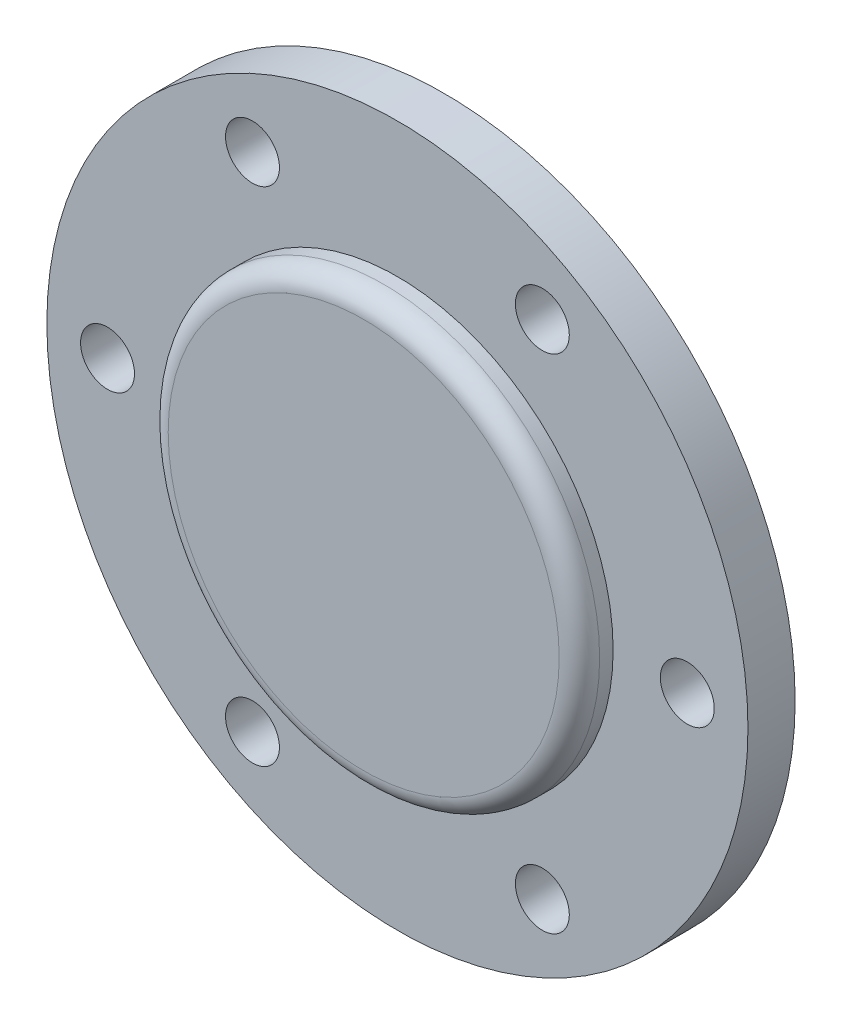
ISO-10303-21;
HEADER;
FILE_DESCRIPTION(('STEP AP214'),'2;1');
FILE_NAME('part.step','',(''),(''),'','','');
FILE_SCHEMA(('AUTOMOTIVE_DESIGN { 1 0 10303 214 1 1 1 1 }'));
ENDSEC;
DATA;
#1=APPLICATION_CONTEXT('core data for automotive mechanical design processes');
#2=APPLICATION_PROTOCOL_DEFINITION('international standard','automotive_design',2000,#1);
#3=PRODUCT_CONTEXT('',#1,'mechanical');
#4=PRODUCT('Part','Part','',(#3));
#5=PRODUCT_RELATED_PRODUCT_CATEGORY('part','',(#4));
#6=PRODUCT_DEFINITION_FORMATION('','',#4);
#7=PRODUCT_DEFINITION_CONTEXT('part definition',#1,'design');
#8=PRODUCT_DEFINITION('design','',#6,#7);
#9=PRODUCT_DEFINITION_SHAPE('','',#8);
#10=(LENGTH_UNIT() NAMED_UNIT(*) SI_UNIT(.MILLI.,.METRE.));
#11=(NAMED_UNIT(*) PLANE_ANGLE_UNIT() SI_UNIT($,.RADIAN.));
#12=(NAMED_UNIT(*) SI_UNIT($,.STERADIAN.) SOLID_ANGLE_UNIT());
#13=UNCERTAINTY_MEASURE_WITH_UNIT(LENGTH_MEASURE(1.E-05),#10,'distance_accuracy_value','');
#14=(GEOMETRIC_REPRESENTATION_CONTEXT(3) GLOBAL_UNCERTAINTY_ASSIGNED_CONTEXT((#13)) GLOBAL_UNIT_ASSIGNED_CONTEXT((#10,
#11,#12)) REPRESENTATION_CONTEXT('',''));
#15=CARTESIAN_POINT('',(0.,0.,0.));
#16=DIRECTION('',(0.,0.,1.));
#17=DIRECTION('',(1.,0.,0.));
#18=AXIS2_PLACEMENT_3D('',#15,#16,#17);
#19=CARTESIAN_POINT('',(0.,0.,3.5));
#20=DIRECTION('',(0.,0.,1.));
#21=DIRECTION('',(1.,0.,0.));
#22=AXIS2_PLACEMENT_3D('',#19,#20,#21);
#23=PLANE('',#22);
#24=CARTESIAN_POINT('',(0.,0.,3.5));
#25=DIRECTION('',(0.,0.,1.));
#26=DIRECTION('',(1.,0.,0.));
#27=AXIS2_PLACEMENT_3D('',#24,#25,#26);
#28=CIRCLE('',#27,16.);
#29=CARTESIAN_POINT('',(16.,0.,3.5));
#30=VERTEX_POINT('',#29);
#31=EDGE_CURVE('E55',#30,#30,#28,.T.);
#32=ORIENTED_EDGE('',*,*,#31,.F.);
#33=EDGE_LOOP('',(#32));
#34=FACE_BOUND('',#33,.T.);
#35=CARTESIAN_POINT('',(10.7499999999998,-18.6195461813655,3.5));
#36=DIRECTION('',(0.,0.,1.));
#37=DIRECTION('',(1.,0.,0.));
#38=AXIS2_PLACEMENT_3D('',#35,#36,#37);
#39=CIRCLE('',#38,2.);
#40=CARTESIAN_POINT('',(12.7499999999998,-18.6195461813655,3.5));
#41=VERTEX_POINT('',#40);
#42=EDGE_CURVE('E68',#41,#41,#39,.T.);
#43=ORIENTED_EDGE('',*,*,#42,.F.);
#44=EDGE_LOOP('',(#43));
#45=FACE_BOUND('',#44,.T.);
#46=CARTESIAN_POINT('',(10.7500000000001,18.6195461813654,3.5));
#47=DIRECTION('',(0.,0.,1.));
#48=DIRECTION('',(1.,0.,0.));
#49=AXIS2_PLACEMENT_3D('',#46,#47,#48);
#50=CIRCLE('',#49,2.00000000000001);
#51=CARTESIAN_POINT('',(12.7500000000001,18.6195461813654,3.5));
#52=VERTEX_POINT('',#51);
#53=EDGE_CURVE('E84',#52,#52,#50,.T.);
#54=ORIENTED_EDGE('',*,*,#53,.F.);
#55=EDGE_LOOP('',(#54));
#56=FACE_BOUND('',#55,.T.);
#57=CARTESIAN_POINT('',(-21.5,0.,3.5));
#58=DIRECTION('',(0.,0.,1.));
#59=DIRECTION('',(1.,0.,0.));
#60=AXIS2_PLACEMENT_3D('',#57,#58,#59);
#61=CIRCLE('',#60,2.);
#62=CARTESIAN_POINT('',(-19.5,0.,3.5));
#63=VERTEX_POINT('',#62);
#64=EDGE_CURVE('E100',#63,#63,#61,.T.);
#65=ORIENTED_EDGE('',*,*,#64,.F.);
#66=EDGE_LOOP('',(#65));
#67=FACE_BOUND('',#66,.T.);
#68=CARTESIAN_POINT('',(0.,0.,3.5));
#69=DIRECTION('',(0.,0.,1.));
#70=DIRECTION('',(1.,0.,0.));
#71=AXIS2_PLACEMENT_3D('',#68,#69,#70);
#72=CIRCLE('',#71,26.);
#73=CARTESIAN_POINT('',(26.,0.,3.5));
#74=VERTEX_POINT('',#73);
#75=EDGE_CURVE('E108',#74,#74,#72,.T.);
#76=ORIENTED_EDGE('',*,*,#75,.T.);
#77=EDGE_LOOP('',(#76));
#78=FACE_BOUND('',#77,.T.);
#79=CARTESIAN_POINT('',(-10.75,18.6195461813655,3.5));
#80=DIRECTION('',(0.,0.,1.));
#81=DIRECTION('',(1.,0.,0.));
#82=AXIS2_PLACEMENT_3D('',#79,#80,#81);
#83=CIRCLE('',#82,2.);
#84=CARTESIAN_POINT('',(-8.74999999999995,18.6195461813655,3.5));
#85=VERTEX_POINT('',#84);
#86=EDGE_CURVE('E92',#85,#85,#83,.T.);
#87=ORIENTED_EDGE('',*,*,#86,.F.);
#88=EDGE_LOOP('',(#87));
#89=FACE_BOUND('',#88,.T.);
#90=CARTESIAN_POINT('',(21.5,-1.50133697570255E-13,3.5));
#91=DIRECTION('',(0.,0.,1.));
#92=DIRECTION('',(1.,0.,0.));
#93=AXIS2_PLACEMENT_3D('',#90,#91,#92);
#94=CIRCLE('',#93,2.);
#95=CARTESIAN_POINT('',(23.5,-1.50133697570255E-13,3.5));
#96=VERTEX_POINT('',#95);
#97=EDGE_CURVE('E76',#96,#96,#94,.T.);
#98=ORIENTED_EDGE('',*,*,#97,.F.);
#99=EDGE_LOOP('',(#98));
#100=FACE_BOUND('',#99,.T.);
#101=CARTESIAN_POINT('',(-10.7500000000002,-18.6195461813653,3.5));
#102=DIRECTION('',(0.,0.,1.));
#103=DIRECTION('',(1.,0.,0.));
#104=AXIS2_PLACEMENT_3D('',#101,#102,#103);
#105=CIRCLE('',#104,2.);
#106=CARTESIAN_POINT('',(-8.75000000000021,-18.6195461813653,3.5));
#107=VERTEX_POINT('',#106);
#108=EDGE_CURVE('E60',#107,#107,#105,.T.);
#109=ORIENTED_EDGE('',*,*,#108,.F.);
#110=EDGE_LOOP('',(#109));
#111=FACE_BOUND('',#110,.T.);
#112=ADVANCED_FACE('F37',(#34,#45,#56,#67,#78,#89,#100,#111),#23,.T.);
#113=CARTESIAN_POINT('',(0.,0.,0.));
#114=DIRECTION('',(0.,0.,1.));
#115=DIRECTION('',(1.,0.,0.));
#116=AXIS2_PLACEMENT_3D('',#113,#114,#115);
#117=PLANE('',#116);
#118=CARTESIAN_POINT('',(0.,0.,0.));
#119=DIRECTION('',(0.,0.,-1.));
#120=DIRECTION('',(-1.,0.,0.));
#121=AXIS2_PLACEMENT_3D('',#118,#119,#120);
#122=CIRCLE('',#121,15.);
#123=CARTESIAN_POINT('',(-15.,0.,0.));
#124=VERTEX_POINT('',#123);
#125=EDGE_CURVE('E10',#124,#124,#122,.T.);
#126=ORIENTED_EDGE('',*,*,#125,.F.);
#127=EDGE_LOOP('',(#126));
#128=FACE_BOUND('',#127,.T.);
#129=CARTESIAN_POINT('',(0.,0.,0.));
#130=DIRECTION('',(0.,0.,1.));
#131=DIRECTION('',(1.,0.,0.));
#132=AXIS2_PLACEMENT_3D('',#129,#130,#131);
#133=CIRCLE('',#132,26.);
#134=CARTESIAN_POINT('',(26.,0.,0.));
#135=VERTEX_POINT('',#134);
#136=EDGE_CURVE('E104',#135,#135,#133,.T.);
#137=ORIENTED_EDGE('',*,*,#136,.F.);
#138=EDGE_LOOP('',(#137));
#139=FACE_BOUND('',#138,.T.);
#140=CARTESIAN_POINT('',(-21.5,0.,0.));
#141=DIRECTION('',(0.,0.,1.));
#142=DIRECTION('',(1.,0.,0.));
#143=AXIS2_PLACEMENT_3D('',#140,#141,#142);
#144=CIRCLE('',#143,2.);
#145=CARTESIAN_POINT('',(-19.5,0.,0.));
#146=VERTEX_POINT('',#145);
#147=EDGE_CURVE('E96',#146,#146,#144,.T.);
#148=ORIENTED_EDGE('',*,*,#147,.T.);
#149=EDGE_LOOP('',(#148));
#150=FACE_BOUND('',#149,.T.);
#151=CARTESIAN_POINT('',(-10.75,18.6195461813655,0.));
#152=DIRECTION('',(0.,0.,1.));
#153=DIRECTION('',(1.,0.,0.));
#154=AXIS2_PLACEMENT_3D('',#151,#152,#153);
#155=CIRCLE('',#154,2.);
#156=CARTESIAN_POINT('',(-8.74999999999995,18.6195461813655,0.));
#157=VERTEX_POINT('',#156);
#158=EDGE_CURVE('E88',#157,#157,#155,.T.);
#159=ORIENTED_EDGE('',*,*,#158,.T.);
#160=EDGE_LOOP('',(#159));
#161=FACE_BOUND('',#160,.T.);
#162=CARTESIAN_POINT('',(10.7500000000001,18.6195461813654,0.));
#163=DIRECTION('',(0.,0.,1.));
#164=DIRECTION('',(1.,0.,0.));
#165=AXIS2_PLACEMENT_3D('',#162,#163,#164);
#166=CIRCLE('',#165,2.00000000000001);
#167=CARTESIAN_POINT('',(12.7500000000001,18.6195461813654,0.));
#168=VERTEX_POINT('',#167);
#169=EDGE_CURVE('E80',#168,#168,#166,.T.);
#170=ORIENTED_EDGE('',*,*,#169,.T.);
#171=EDGE_LOOP('',(#170));
#172=FACE_BOUND('',#171,.T.);
#173=CARTESIAN_POINT('',(21.5,-1.50133697570255E-13,0.));
#174=DIRECTION('',(0.,0.,1.));
#175=DIRECTION('',(1.,0.,0.));
#176=AXIS2_PLACEMENT_3D('',#173,#174,#175);
#177=CIRCLE('',#176,2.);
#178=CARTESIAN_POINT('',(23.5,-1.50133697570255E-13,0.));
#179=VERTEX_POINT('',#178);
#180=EDGE_CURVE('E72',#179,#179,#177,.T.);
#181=ORIENTED_EDGE('',*,*,#180,.T.);
#182=EDGE_LOOP('',(#181));
#183=FACE_BOUND('',#182,.T.);
#184=CARTESIAN_POINT('',(10.7499999999998,-18.6195461813655,0.));
#185=DIRECTION('',(0.,0.,1.));
#186=DIRECTION('',(1.,0.,0.));
#187=AXIS2_PLACEMENT_3D('',#184,#185,#186);
#188=CIRCLE('',#187,2.);
#189=CARTESIAN_POINT('',(12.7499999999998,-18.6195461813655,0.));
#190=VERTEX_POINT('',#189);
#191=EDGE_CURVE('E64',#190,#190,#188,.T.);
#192=ORIENTED_EDGE('',*,*,#191,.T.);
#193=EDGE_LOOP('',(#192));
#194=FACE_BOUND('',#193,.T.);
#195=CARTESIAN_POINT('',(-10.7500000000002,-18.6195461813653,0.));
#196=DIRECTION('',(0.,0.,1.));
#197=DIRECTION('',(1.,0.,0.));
#198=AXIS2_PLACEMENT_3D('',#195,#196,#197);
#199=CIRCLE('',#198,2.);
#200=CARTESIAN_POINT('',(-8.75000000000021,-18.6195461813653,0.));
#201=VERTEX_POINT('',#200);
#202=EDGE_CURVE('E59',#201,#201,#199,.T.);
#203=ORIENTED_EDGE('',*,*,#202,.T.);
#204=EDGE_LOOP('',(#203));
#205=FACE_BOUND('',#204,.T.);
#206=ADVANCED_FACE('F134',(#128,#139,#150,#161,#172,#183,#194,#205),#117,.F.);
#207=CARTESIAN_POINT('',(0.,0.,3.5));
#208=DIRECTION('',(0.,0.,-1.));
#209=DIRECTION('',(-1.,0.,0.));
#210=AXIS2_PLACEMENT_3D('',#207,#208,#209);
#211=CYLINDRICAL_SURFACE('',#210,26.);
#212=ORIENTED_EDGE('',*,*,#75,.F.);
#213=EDGE_LOOP('',(#212));
#214=FACE_BOUND('',#213,.T.);
#215=ORIENTED_EDGE('',*,*,#136,.T.);
#216=EDGE_LOOP('',(#215));
#217=FACE_BOUND('',#216,.T.);
#218=ADVANCED_FACE('F140',(#214,#217),#211,.T.);
#219=CARTESIAN_POINT('',(-21.5,0.,3.5));
#220=DIRECTION('',(0.,0.,-1.));
#221=DIRECTION('',(-1.,0.,0.));
#222=AXIS2_PLACEMENT_3D('',#219,#220,#221);
#223=CYLINDRICAL_SURFACE('',#222,2.);
#224=ORIENTED_EDGE('',*,*,#64,.T.);
#225=EDGE_LOOP('',(#224));
#226=FACE_BOUND('',#225,.T.);
#227=ORIENTED_EDGE('',*,*,#147,.F.);
#228=EDGE_LOOP('',(#227));
#229=FACE_BOUND('',#228,.T.);
#230=ADVANCED_FACE('F146',(#226,#229),#223,.F.);
#231=CARTESIAN_POINT('',(-10.75,18.6195461813655,3.5));
#232=DIRECTION('',(0.,0.,-1.));
#233=DIRECTION('',(-1.,0.,0.));
#234=AXIS2_PLACEMENT_3D('',#231,#232,#233);
#235=CYLINDRICAL_SURFACE('',#234,2.);
#236=ORIENTED_EDGE('',*,*,#86,.T.);
#237=EDGE_LOOP('',(#236));
#238=FACE_BOUND('',#237,.T.);
#239=ORIENTED_EDGE('',*,*,#158,.F.);
#240=EDGE_LOOP('',(#239));
#241=FACE_BOUND('',#240,.T.);
#242=ADVANCED_FACE('F153',(#238,#241),#235,.F.);
#243=CARTESIAN_POINT('',(10.7500000000001,18.6195461813654,3.5));
#244=DIRECTION('',(0.,0.,-1.));
#245=DIRECTION('',(-1.,0.,0.));
#246=AXIS2_PLACEMENT_3D('',#243,#244,#245);
#247=CYLINDRICAL_SURFACE('',#246,2.00000000000001);
#248=ORIENTED_EDGE('',*,*,#53,.T.);
#249=EDGE_LOOP('',(#248));
#250=FACE_BOUND('',#249,.T.);
#251=ORIENTED_EDGE('',*,*,#169,.F.);
#252=EDGE_LOOP('',(#251));
#253=FACE_BOUND('',#252,.T.);
#254=ADVANCED_FACE('F189',(#250,#253),#247,.F.);
#255=CARTESIAN_POINT('',(21.5,-1.50133697570255E-13,3.5));
#256=DIRECTION('',(0.,0.,-1.));
#257=DIRECTION('',(-1.,0.,0.));
#258=AXIS2_PLACEMENT_3D('',#255,#256,#257);
#259=CYLINDRICAL_SURFACE('',#258,2.);
#260=ORIENTED_EDGE('',*,*,#97,.T.);
#261=EDGE_LOOP('',(#260));
#262=FACE_BOUND('',#261,.T.);
#263=ORIENTED_EDGE('',*,*,#180,.F.);
#264=EDGE_LOOP('',(#263));
#265=FACE_BOUND('',#264,.T.);
#266=ADVANCED_FACE('F183',(#262,#265),#259,.F.);
#267=CARTESIAN_POINT('',(10.7499999999998,-18.6195461813655,3.5));
#268=DIRECTION('',(0.,0.,-1.));
#269=DIRECTION('',(-1.,0.,0.));
#270=AXIS2_PLACEMENT_3D('',#267,#268,#269);
#271=CYLINDRICAL_SURFACE('',#270,2.);
#272=ORIENTED_EDGE('',*,*,#42,.T.);
#273=EDGE_LOOP('',(#272));
#274=FACE_BOUND('',#273,.T.);
#275=ORIENTED_EDGE('',*,*,#191,.F.);
#276=EDGE_LOOP('',(#275));
#277=FACE_BOUND('',#276,.T.);
#278=ADVANCED_FACE('F174',(#274,#277),#271,.F.);
#279=CARTESIAN_POINT('',(-10.7500000000002,-18.6195461813653,3.5));
#280=DIRECTION('',(0.,0.,-1.));
#281=DIRECTION('',(-1.,0.,0.));
#282=AXIS2_PLACEMENT_3D('',#279,#280,#281);
#283=CYLINDRICAL_SURFACE('',#282,2.);
#284=ORIENTED_EDGE('',*,*,#108,.T.);
#285=EDGE_LOOP('',(#284));
#286=FACE_BOUND('',#285,.T.);
#287=ORIENTED_EDGE('',*,*,#202,.F.);
#288=EDGE_LOOP('',(#287));
#289=FACE_BOUND('',#288,.T.);
#290=ADVANCED_FACE('F172',(#286,#289),#283,.F.);
#291=CARTESIAN_POINT('',(0.,0.,6.));
#292=DIRECTION('',(0.,0.,-1.));
#293=DIRECTION('',(-1.,0.,0.));
#294=AXIS2_PLACEMENT_3D('',#291,#292,#293);
#295=CYLINDRICAL_SURFACE('',#294,16.);
#296=CARTESIAN_POINT('',(0.,0.,4.5));
#297=DIRECTION('',(0.,0.,1.));
#298=DIRECTION('',(1.,0.,0.));
#299=AXIS2_PLACEMENT_3D('',#296,#297,#298);
#300=CIRCLE('',#299,16.);
#301=CARTESIAN_POINT('',(16.,0.,4.5));
#302=VERTEX_POINT('',#301);
#303=EDGE_CURVE('E41',#302,#302,#300,.F.);
#304=ORIENTED_EDGE('',*,*,#303,.T.);
#305=EDGE_LOOP('',(#304));
#306=FACE_BOUND('',#305,.T.);
#307=ORIENTED_EDGE('',*,*,#31,.T.);
#308=EDGE_LOOP('',(#307));
#309=FACE_BOUND('',#308,.T.);
#310=ADVANCED_FACE('F130',(#306,#309),#295,.T.);
#311=CARTESIAN_POINT('',(0.,0.,6.));
#312=DIRECTION('',(0.,0.,1.));
#313=DIRECTION('',(1.,0.,0.));
#314=AXIS2_PLACEMENT_3D('',#311,#312,#313);
#315=PLANE('',#314);
#316=CARTESIAN_POINT('',(0.,0.,6.));
#317=DIRECTION('',(0.,0.,1.));
#318=DIRECTION('',(1.,0.,0.));
#319=AXIS2_PLACEMENT_3D('',#316,#317,#318);
#320=CIRCLE('',#319,14.5);
#321=CARTESIAN_POINT('',(14.5,0.,6.));
#322=VERTEX_POINT('',#321);
#323=EDGE_CURVE('E51',#322,#322,#320,.T.);
#324=ORIENTED_EDGE('',*,*,#323,.T.);
#325=EDGE_LOOP('',(#324));
#326=FACE_BOUND('',#325,.T.);
#327=ADVANCED_FACE('F118',(#326),#315,.T.);
#328=CARTESIAN_POINT('',(0.,0.,4.5));
#329=DIRECTION('',(0.,0.,1.));
#330=DIRECTION('',(1.,0.,0.));
#331=AXIS2_PLACEMENT_3D('',#328,#329,#330);
#332=TOROIDAL_SURFACE('',#331,14.5,1.5);
#333=ORIENTED_EDGE('',*,*,#303,.F.);
#334=EDGE_LOOP('',(#333));
#335=FACE_BOUND('',#334,.T.);
#336=ORIENTED_EDGE('',*,*,#323,.F.);
#337=EDGE_LOOP('',(#336));
#338=FACE_BOUND('',#337,.T.);
#339=ADVANCED_FACE('F39',(#335,#338),#332,.T.);
#340=CARTESIAN_POINT('',(0.,0.,-1.));
#341=DIRECTION('',(0.,0.,1.));
#342=DIRECTION('',(1.,0.,0.));
#343=AXIS2_PLACEMENT_3D('',#340,#341,#342);
#344=CYLINDRICAL_SURFACE('',#343,15.);
#345=CARTESIAN_POINT('',(0.,0.,-1.));
#346=DIRECTION('',(0.,0.,-1.));
#347=DIRECTION('',(-1.,0.,0.));
#348=AXIS2_PLACEMENT_3D('',#345,#346,#347);
#349=CIRCLE('',#348,15.);
#350=CARTESIAN_POINT('',(-15.,0.,-1.));
#351=VERTEX_POINT('',#350);
#352=EDGE_CURVE('E54',#351,#351,#349,.T.);
#353=ORIENTED_EDGE('',*,*,#352,.F.);
#354=EDGE_LOOP('',(#353));
#355=FACE_BOUND('',#354,.T.);
#356=ORIENTED_EDGE('',*,*,#125,.T.);
#357=EDGE_LOOP('',(#356));
#358=FACE_BOUND('',#357,.T.);
#359=ADVANCED_FACE('F121',(#355,#358),#344,.T.);
#360=CARTESIAN_POINT('',(0.,0.,-1.));
#361=DIRECTION('',(0.,0.,-1.));
#362=DIRECTION('',(-1.,0.,0.));
#363=AXIS2_PLACEMENT_3D('',#360,#361,#362);
#364=PLANE('',#363);
#365=ORIENTED_EDGE('',*,*,#352,.T.);
#366=EDGE_LOOP('',(#365));
#367=FACE_BOUND('',#366,.T.);
#368=ADVANCED_FACE('F127',(#367),#364,.T.);
#369=CLOSED_SHELL('',(#112,#206,#218,#230,#242,#254,#266,#278,#290,#310,#327,#339,#359,#368));
#370=MANIFOLD_SOLID_BREP('B2',#369);
#371=ADVANCED_BREP_SHAPE_REPRESENTATION('',(#18,#370),#14);
#372=SHAPE_DEFINITION_REPRESENTATION(#9,#371);
ENDSEC;
END-ISO-10303-21;
